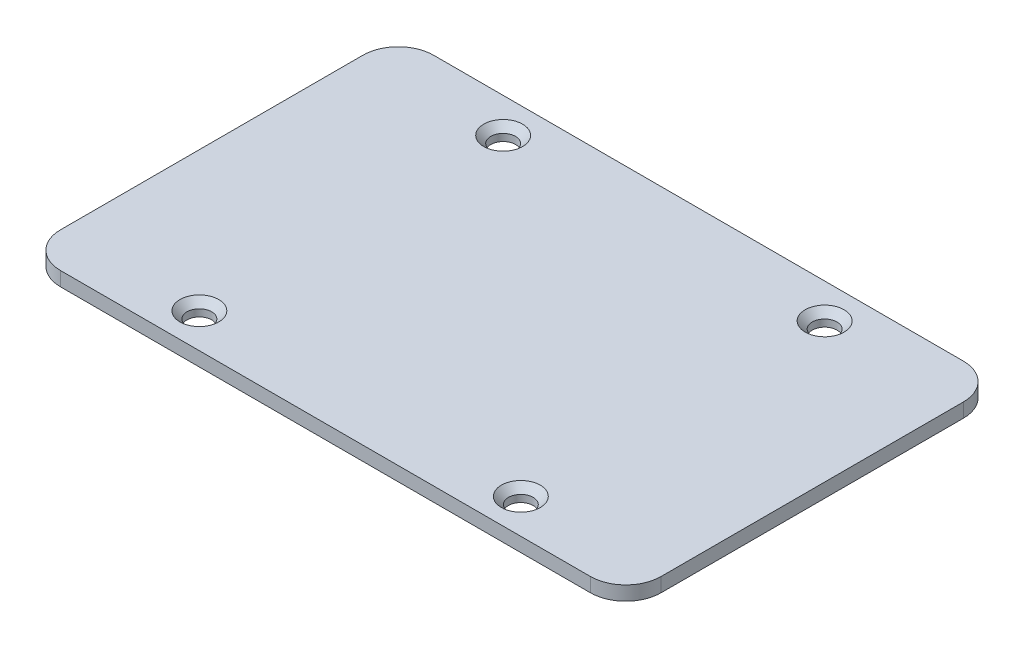
ISO-10303-21;
HEADER;
FILE_DESCRIPTION(('STEP AP214'),'2;1');
FILE_NAME('part.step','',(''),(''),'','','');
FILE_SCHEMA(('AUTOMOTIVE_DESIGN { 1 0 10303 214 1 1 1 1 }'));
ENDSEC;
DATA;
#1=APPLICATION_CONTEXT('core data for automotive mechanical design processes');
#2=APPLICATION_PROTOCOL_DEFINITION('international standard','automotive_design',2000,#1);
#3=PRODUCT_CONTEXT('',#1,'mechanical');
#4=PRODUCT('Part','Part','',(#3));
#5=PRODUCT_RELATED_PRODUCT_CATEGORY('part','',(#4));
#6=PRODUCT_DEFINITION_FORMATION('','',#4);
#7=PRODUCT_DEFINITION_CONTEXT('part definition',#1,'design');
#8=PRODUCT_DEFINITION('design','',#6,#7);
#9=PRODUCT_DEFINITION_SHAPE('','',#8);
#10=(LENGTH_UNIT() NAMED_UNIT(*) SI_UNIT(.MILLI.,.METRE.));
#11=(NAMED_UNIT(*) PLANE_ANGLE_UNIT() SI_UNIT($,.RADIAN.));
#12=(NAMED_UNIT(*) SI_UNIT($,.STERADIAN.) SOLID_ANGLE_UNIT());
#13=UNCERTAINTY_MEASURE_WITH_UNIT(LENGTH_MEASURE(1.E-05),#10,'distance_accuracy_value','');
#14=(GEOMETRIC_REPRESENTATION_CONTEXT(3) GLOBAL_UNCERTAINTY_ASSIGNED_CONTEXT((#13)) GLOBAL_UNIT_ASSIGNED_CONTEXT((#10,
#11,#12)) REPRESENTATION_CONTEXT('',''));
#15=CARTESIAN_POINT('',(0.,0.,0.));
#16=DIRECTION('',(0.,0.,1.));
#17=DIRECTION('',(1.,0.,0.));
#18=AXIS2_PLACEMENT_3D('',#15,#16,#17);
#19=CARTESIAN_POINT('',(42.5,1.,-26.4));
#20=DIRECTION('',(-1.,0.,0.));
#21=DIRECTION('',(0.,0.,1.));
#22=AXIS2_PLACEMENT_3D('',#19,#20,#21);
#23=PLANE('',#22);
#24=DIRECTION('',(0.,0.,-1.));
#25=VECTOR('',#24,1.);
#26=CARTESIAN_POINT('',(42.5,-1.,-26.4));
#27=LINE('',#26,#25);
#28=CARTESIAN_POINT('',(42.5,-1.,21.4));
#29=VERTEX_POINT('',#28);
#30=CARTESIAN_POINT('',(42.5,-1.,-21.4));
#31=VERTEX_POINT('',#30);
#32=EDGE_CURVE('E142',#29,#31,#27,.T.);
#33=ORIENTED_EDGE('',*,*,#32,.T.);
#34=DIRECTION('',(0.,-1.,0.));
#35=VECTOR('',#34,1.);
#36=CARTESIAN_POINT('',(42.5,1.,-21.4));
#37=LINE('',#36,#35);
#38=CARTESIAN_POINT('',(42.5,1.,-21.4));
#39=VERTEX_POINT('',#38);
#40=EDGE_CURVE('E120',#31,#39,#37,.F.);
#41=ORIENTED_EDGE('',*,*,#40,.T.);
#42=DIRECTION('',(0.,0.,-1.));
#43=VECTOR('',#42,1.);
#44=CARTESIAN_POINT('',(42.5,1.,-26.4));
#45=LINE('',#44,#43);
#46=CARTESIAN_POINT('',(42.5,1.,21.4));
#47=VERTEX_POINT('',#46);
#48=EDGE_CURVE('E152',#47,#39,#45,.T.);
#49=ORIENTED_EDGE('',*,*,#48,.F.);
#50=DIRECTION('',(0.,-1.,0.));
#51=VECTOR('',#50,1.);
#52=CARTESIAN_POINT('',(42.5,1.,21.4));
#53=LINE('',#52,#51);
#54=EDGE_CURVE('E125',#47,#29,#53,.T.);
#55=ORIENTED_EDGE('',*,*,#54,.T.);
#56=EDGE_LOOP('',(#33,#41,#49,#55));
#57=FACE_BOUND('',#56,.T.);
#58=ADVANCED_FACE('F49',(#57),#23,.F.);
#59=CARTESIAN_POINT('',(-42.5,1.,-26.4));
#60=DIRECTION('',(0.,0.,1.));
#61=DIRECTION('',(1.,0.,0.));
#62=AXIS2_PLACEMENT_3D('',#59,#60,#61);
#63=PLANE('',#62);
#64=DIRECTION('',(-1.,0.,0.));
#65=VECTOR('',#64,1.);
#66=CARTESIAN_POINT('',(-42.5,1.,-26.4));
#67=LINE('',#66,#65);
#68=CARTESIAN_POINT('',(37.5,1.,-26.4));
#69=VERTEX_POINT('',#68);
#70=CARTESIAN_POINT('',(-37.5,1.,-26.4));
#71=VERTEX_POINT('',#70);
#72=EDGE_CURVE('E135',#69,#71,#67,.T.);
#73=ORIENTED_EDGE('',*,*,#72,.F.);
#74=DIRECTION('',(0.,-1.,0.));
#75=VECTOR('',#74,1.);
#76=CARTESIAN_POINT('',(37.5,1.,-26.4));
#77=LINE('',#76,#75);
#78=CARTESIAN_POINT('',(37.5,-1.,-26.4));
#79=VERTEX_POINT('',#78);
#80=EDGE_CURVE('E119',#69,#79,#77,.T.);
#81=ORIENTED_EDGE('',*,*,#80,.T.);
#82=DIRECTION('',(-1.,0.,0.));
#83=VECTOR('',#82,1.);
#84=CARTESIAN_POINT('',(-42.5,-1.,-26.4));
#85=LINE('',#84,#83);
#86=CARTESIAN_POINT('',(-37.5,-1.,-26.4));
#87=VERTEX_POINT('',#86);
#88=EDGE_CURVE('E132',#79,#87,#85,.T.);
#89=ORIENTED_EDGE('',*,*,#88,.T.);
#90=DIRECTION('',(0.,-1.,0.));
#91=VECTOR('',#90,1.);
#92=CARTESIAN_POINT('',(-37.5,1.,-26.4));
#93=LINE('',#92,#91);
#94=EDGE_CURVE('E137',#87,#71,#93,.F.);
#95=ORIENTED_EDGE('',*,*,#94,.T.);
#96=EDGE_LOOP('',(#73,#81,#89,#95));
#97=FACE_BOUND('',#96,.T.);
#98=ADVANCED_FACE('F131',(#97),#63,.F.);
#99=CARTESIAN_POINT('',(-42.5,1.,-26.4));
#100=DIRECTION('',(1.,0.,0.));
#101=DIRECTION('',(0.,0.,-1.));
#102=AXIS2_PLACEMENT_3D('',#99,#100,#101);
#103=PLANE('',#102);
#104=DIRECTION('',(0.,0.,1.));
#105=VECTOR('',#104,1.);
#106=CARTESIAN_POINT('',(-42.5,-1.,-26.4));
#107=LINE('',#106,#105);
#108=CARTESIAN_POINT('',(-42.5,-1.,-21.4));
#109=VERTEX_POINT('',#108);
#110=CARTESIAN_POINT('',(-42.5,-1.,21.4));
#111=VERTEX_POINT('',#110);
#112=EDGE_CURVE('E141',#109,#111,#107,.T.);
#113=ORIENTED_EDGE('',*,*,#112,.T.);
#114=DIRECTION('',(0.,-1.,0.));
#115=VECTOR('',#114,1.);
#116=CARTESIAN_POINT('',(-42.5,1.,21.4));
#117=LINE('',#116,#115);
#118=CARTESIAN_POINT('',(-42.5,1.,21.4));
#119=VERTEX_POINT('',#118);
#120=EDGE_CURVE('E11',#111,#119,#117,.F.);
#121=ORIENTED_EDGE('',*,*,#120,.T.);
#122=DIRECTION('',(0.,0.,1.));
#123=VECTOR('',#122,1.);
#124=CARTESIAN_POINT('',(-42.5,1.,-26.4));
#125=LINE('',#124,#123);
#126=CARTESIAN_POINT('',(-42.5,1.,-21.4));
#127=VERTEX_POINT('',#126);
#128=EDGE_CURVE('E202',#127,#119,#125,.T.);
#129=ORIENTED_EDGE('',*,*,#128,.F.);
#130=DIRECTION('',(0.,-1.,0.));
#131=VECTOR('',#130,1.);
#132=CARTESIAN_POINT('',(-42.5,1.,-21.4));
#133=LINE('',#132,#131);
#134=EDGE_CURVE('E57',#127,#109,#133,.T.);
#135=ORIENTED_EDGE('',*,*,#134,.T.);
#136=EDGE_LOOP('',(#113,#121,#129,#135));
#137=FACE_BOUND('',#136,.T.);
#138=ADVANCED_FACE('F200',(#137),#103,.F.);
#139=CARTESIAN_POINT('',(-42.5,1.,26.4));
#140=DIRECTION('',(0.,0.,-1.));
#141=DIRECTION('',(-1.,0.,0.));
#142=AXIS2_PLACEMENT_3D('',#139,#140,#141);
#143=PLANE('',#142);
#144=DIRECTION('',(1.,0.,0.));
#145=VECTOR('',#144,1.);
#146=CARTESIAN_POINT('',(-42.5,-1.,26.4));
#147=LINE('',#146,#145);
#148=CARTESIAN_POINT('',(-37.5,-1.,26.4));
#149=VERTEX_POINT('',#148);
#150=CARTESIAN_POINT('',(37.5,-1.,26.4));
#151=VERTEX_POINT('',#150);
#152=EDGE_CURVE('E145',#149,#151,#147,.T.);
#153=ORIENTED_EDGE('',*,*,#152,.T.);
#154=DIRECTION('',(0.,-1.,0.));
#155=VECTOR('',#154,1.);
#156=CARTESIAN_POINT('',(37.5,1.,26.4));
#157=LINE('',#156,#155);
#158=CARTESIAN_POINT('',(37.5,1.,26.4));
#159=VERTEX_POINT('',#158);
#160=EDGE_CURVE('E64',#151,#159,#157,.F.);
#161=ORIENTED_EDGE('',*,*,#160,.T.);
#162=DIRECTION('',(1.,0.,0.));
#163=VECTOR('',#162,1.);
#164=CARTESIAN_POINT('',(-42.5,1.,26.4));
#165=LINE('',#164,#163);
#166=CARTESIAN_POINT('',(-37.5,1.,26.4));
#167=VERTEX_POINT('',#166);
#168=EDGE_CURVE('E157',#167,#159,#165,.T.);
#169=ORIENTED_EDGE('',*,*,#168,.F.);
#170=DIRECTION('',(0.,-1.,0.));
#171=VECTOR('',#170,1.);
#172=CARTESIAN_POINT('',(-37.5,1.,26.4));
#173=LINE('',#172,#171);
#174=EDGE_CURVE('E193',#167,#149,#173,.T.);
#175=ORIENTED_EDGE('',*,*,#174,.T.);
#176=EDGE_LOOP('',(#153,#161,#169,#175));
#177=FACE_BOUND('',#176,.T.);
#178=ADVANCED_FACE('F209',(#177),#143,.F.);
#179=CARTESIAN_POINT('',(0.,1.,0.));
#180=DIRECTION('',(0.,1.,0.));
#181=DIRECTION('',(0.,0.,1.));
#182=AXIS2_PLACEMENT_3D('',#179,#180,#181);
#183=PLANE('',#182);
#184=CARTESIAN_POINT('',(22.75,1.,-21.5));
#185=DIRECTION('',(0.,1.,0.));
#186=DIRECTION('',(0.,0.,1.));
#187=AXIS2_PLACEMENT_3D('',#184,#185,#186);
#188=CIRCLE('',#187,2.75000000000002);
#189=CARTESIAN_POINT('',(22.75,1.,-18.75));
#190=VERTEX_POINT('',#189);
#191=EDGE_CURVE('E166',#190,#190,#188,.F.);
#192=ORIENTED_EDGE('',*,*,#191,.T.);
#193=EDGE_LOOP('',(#192));
#194=FACE_BOUND('',#193,.T.);
#195=CARTESIAN_POINT('',(22.75,1.,21.5));
#196=DIRECTION('',(0.,1.,0.));
#197=DIRECTION('',(0.,0.,1.));
#198=AXIS2_PLACEMENT_3D('',#195,#196,#197);
#199=CIRCLE('',#198,2.75000000000002);
#200=CARTESIAN_POINT('',(22.75,1.,24.25));
#201=VERTEX_POINT('',#200);
#202=EDGE_CURVE('E163',#201,#201,#199,.F.);
#203=ORIENTED_EDGE('',*,*,#202,.T.);
#204=EDGE_LOOP('',(#203));
#205=FACE_BOUND('',#204,.T.);
#206=CARTESIAN_POINT('',(-22.75,1.,21.5));
#207=DIRECTION('',(0.,1.,0.));
#208=DIRECTION('',(0.,0.,1.));
#209=AXIS2_PLACEMENT_3D('',#206,#207,#208);
#210=CIRCLE('',#209,2.75000000000002);
#211=CARTESIAN_POINT('',(-22.75,1.,24.25));
#212=VERTEX_POINT('',#211);
#213=EDGE_CURVE('E160',#212,#212,#210,.F.);
#214=ORIENTED_EDGE('',*,*,#213,.T.);
#215=EDGE_LOOP('',(#214));
#216=FACE_BOUND('',#215,.T.);
#217=CARTESIAN_POINT('',(-22.75,1.,-21.5));
#218=DIRECTION('',(0.,1.,0.));
#219=DIRECTION('',(0.,0.,1.));
#220=AXIS2_PLACEMENT_3D('',#217,#218,#219);
#221=CIRCLE('',#220,2.75000000000002);
#222=CARTESIAN_POINT('',(-22.75,1.,-18.75));
#223=VERTEX_POINT('',#222);
#224=EDGE_CURVE('E156',#223,#223,#221,.F.);
#225=ORIENTED_EDGE('',*,*,#224,.T.);
#226=EDGE_LOOP('',(#225));
#227=FACE_BOUND('',#226,.T.);
#228=ORIENTED_EDGE('',*,*,#48,.T.);
#229=CARTESIAN_POINT('',(37.5,1.,-21.4));
#230=DIRECTION('',(0.,1.,0.));
#231=DIRECTION('',(0.,0.,1.));
#232=AXIS2_PLACEMENT_3D('',#229,#230,#231);
#233=CIRCLE('',#232,5.);
#234=EDGE_CURVE('E191',#39,#69,#233,.T.);
#235=ORIENTED_EDGE('',*,*,#234,.T.);
#236=ORIENTED_EDGE('',*,*,#72,.T.);
#237=CARTESIAN_POINT('',(-37.5,1.,-21.4));
#238=DIRECTION('',(0.,1.,0.));
#239=DIRECTION('',(0.,0.,1.));
#240=AXIS2_PLACEMENT_3D('',#237,#238,#239);
#241=CIRCLE('',#240,5.);
#242=EDGE_CURVE('E186',#71,#127,#241,.T.);
#243=ORIENTED_EDGE('',*,*,#242,.T.);
#244=ORIENTED_EDGE('',*,*,#128,.T.);
#245=CARTESIAN_POINT('',(-37.5,1.,21.4));
#246=DIRECTION('',(0.,1.,0.));
#247=DIRECTION('',(0.,0.,1.));
#248=AXIS2_PLACEMENT_3D('',#245,#246,#247);
#249=CIRCLE('',#248,5.);
#250=EDGE_CURVE('E71',#119,#167,#249,.T.);
#251=ORIENTED_EDGE('',*,*,#250,.T.);
#252=ORIENTED_EDGE('',*,*,#168,.T.);
#253=CARTESIAN_POINT('',(37.5,1.,21.4));
#254=DIRECTION('',(0.,1.,0.));
#255=DIRECTION('',(0.,0.,1.));
#256=AXIS2_PLACEMENT_3D('',#253,#254,#255);
#257=CIRCLE('',#256,5.);
#258=EDGE_CURVE('E189',#159,#47,#257,.T.);
#259=ORIENTED_EDGE('',*,*,#258,.T.);
#260=EDGE_LOOP('',(#228,#235,#236,#243,#244,#251,#252,#259));
#261=FACE_BOUND('',#260,.T.);
#262=ADVANCED_FACE('F293',(#194,#205,#216,#227,#261),#183,.T.);
#263=CARTESIAN_POINT('',(0.,-1.,0.));
#264=DIRECTION('',(0.,1.,0.));
#265=DIRECTION('',(0.,0.,1.));
#266=AXIS2_PLACEMENT_3D('',#263,#264,#265);
#267=PLANE('',#266);
#268=CARTESIAN_POINT('',(-22.75,-1.,21.5));
#269=DIRECTION('',(0.,1.,0.));
#270=DIRECTION('',(0.,0.,1.));
#271=AXIS2_PLACEMENT_3D('',#268,#269,#270);
#272=CIRCLE('',#271,1.75);
#273=CARTESIAN_POINT('',(-22.75,-1.,23.25));
#274=VERTEX_POINT('',#273);
#275=EDGE_CURVE('E219',#274,#274,#272,.T.);
#276=ORIENTED_EDGE('',*,*,#275,.T.);
#277=EDGE_LOOP('',(#276));
#278=FACE_BOUND('',#277,.T.);
#279=CARTESIAN_POINT('',(22.75,-1.,21.5));
#280=DIRECTION('',(0.,1.,0.));
#281=DIRECTION('',(0.,0.,1.));
#282=AXIS2_PLACEMENT_3D('',#279,#280,#281);
#283=CIRCLE('',#282,1.75);
#284=CARTESIAN_POINT('',(22.75,-1.,23.25));
#285=VERTEX_POINT('',#284);
#286=EDGE_CURVE('E222',#285,#285,#283,.T.);
#287=ORIENTED_EDGE('',*,*,#286,.T.);
#288=EDGE_LOOP('',(#287));
#289=FACE_BOUND('',#288,.T.);
#290=CARTESIAN_POINT('',(22.75,-1.,-21.5));
#291=DIRECTION('',(0.,1.,0.));
#292=DIRECTION('',(0.,0.,1.));
#293=AXIS2_PLACEMENT_3D('',#290,#291,#292);
#294=CIRCLE('',#293,1.75);
#295=CARTESIAN_POINT('',(22.75,-1.,-19.75));
#296=VERTEX_POINT('',#295);
#297=EDGE_CURVE('E218',#296,#296,#294,.T.);
#298=ORIENTED_EDGE('',*,*,#297,.T.);
#299=EDGE_LOOP('',(#298));
#300=FACE_BOUND('',#299,.T.);
#301=CARTESIAN_POINT('',(-22.75,-1.,-21.5));
#302=DIRECTION('',(0.,1.,0.));
#303=DIRECTION('',(0.,0.,1.));
#304=AXIS2_PLACEMENT_3D('',#301,#302,#303);
#305=CIRCLE('',#304,1.75);
#306=CARTESIAN_POINT('',(-22.75,-1.,-19.75));
#307=VERTEX_POINT('',#306);
#308=EDGE_CURVE('E147',#307,#307,#305,.T.);
#309=ORIENTED_EDGE('',*,*,#308,.T.);
#310=EDGE_LOOP('',(#309));
#311=FACE_BOUND('',#310,.T.);
#312=ORIENTED_EDGE('',*,*,#88,.F.);
#313=CARTESIAN_POINT('',(37.5,-1.,-21.4));
#314=DIRECTION('',(0.,1.,0.));
#315=DIRECTION('',(0.,0.,1.));
#316=AXIS2_PLACEMENT_3D('',#313,#314,#315);
#317=CIRCLE('',#316,5.);
#318=EDGE_CURVE('E115',#79,#31,#317,.F.);
#319=ORIENTED_EDGE('',*,*,#318,.T.);
#320=ORIENTED_EDGE('',*,*,#32,.F.);
#321=CARTESIAN_POINT('',(37.5,-1.,21.4));
#322=DIRECTION('',(0.,1.,0.));
#323=DIRECTION('',(0.,0.,1.));
#324=AXIS2_PLACEMENT_3D('',#321,#322,#323);
#325=CIRCLE('',#324,5.);
#326=EDGE_CURVE('E126',#29,#151,#325,.F.);
#327=ORIENTED_EDGE('',*,*,#326,.T.);
#328=ORIENTED_EDGE('',*,*,#152,.F.);
#329=CARTESIAN_POINT('',(-37.5,-1.,21.4));
#330=DIRECTION('',(0.,1.,0.));
#331=DIRECTION('',(0.,0.,1.));
#332=AXIS2_PLACEMENT_3D('',#329,#330,#331);
#333=CIRCLE('',#332,5.);
#334=EDGE_CURVE('E180',#149,#111,#333,.F.);
#335=ORIENTED_EDGE('',*,*,#334,.T.);
#336=ORIENTED_EDGE('',*,*,#112,.F.);
#337=CARTESIAN_POINT('',(-37.5,-1.,-21.4));
#338=DIRECTION('',(0.,1.,0.));
#339=DIRECTION('',(0.,0.,1.));
#340=AXIS2_PLACEMENT_3D('',#337,#338,#339);
#341=CIRCLE('',#340,5.);
#342=EDGE_CURVE('E136',#109,#87,#341,.F.);
#343=ORIENTED_EDGE('',*,*,#342,.T.);
#344=EDGE_LOOP('',(#312,#319,#320,#327,#328,#335,#336,#343));
#345=FACE_BOUND('',#344,.T.);
#346=ADVANCED_FACE('F139',(#278,#289,#300,#311,#345),#267,.F.);
#347=CARTESIAN_POINT('',(-22.75,-1.,-21.5));
#348=DIRECTION('',(0.,1.,0.));
#349=DIRECTION('',(0.,0.,1.));
#350=AXIS2_PLACEMENT_3D('',#347,#348,#349);
#351=CYLINDRICAL_SURFACE('',#350,1.75);
#352=CARTESIAN_POINT('',(-22.75,0.,-21.5));
#353=DIRECTION('',(0.,1.,0.));
#354=DIRECTION('',(0.,0.,1.));
#355=AXIS2_PLACEMENT_3D('',#352,#353,#354);
#356=CIRCLE('',#355,1.75);
#357=CARTESIAN_POINT('',(-22.75,0.,-19.75));
#358=VERTEX_POINT('',#357);
#359=EDGE_CURVE('E175',#358,#358,#356,.T.);
#360=ORIENTED_EDGE('',*,*,#359,.T.);
#361=EDGE_LOOP('',(#360));
#362=FACE_BOUND('',#361,.T.);
#363=ORIENTED_EDGE('',*,*,#308,.F.);
#364=EDGE_LOOP('',(#363));
#365=FACE_BOUND('',#364,.T.);
#366=ADVANCED_FACE('F233',(#362,#365),#351,.F.);
#367=CARTESIAN_POINT('',(22.75,-1.,-21.5));
#368=DIRECTION('',(0.,1.,0.));
#369=DIRECTION('',(0.,0.,1.));
#370=AXIS2_PLACEMENT_3D('',#367,#368,#369);
#371=CYLINDRICAL_SURFACE('',#370,1.75);
#372=CARTESIAN_POINT('',(22.75,0.,-21.5));
#373=DIRECTION('',(0.,1.,0.));
#374=DIRECTION('',(0.,0.,1.));
#375=AXIS2_PLACEMENT_3D('',#372,#373,#374);
#376=CIRCLE('',#375,1.75);
#377=CARTESIAN_POINT('',(22.75,0.,-19.75));
#378=VERTEX_POINT('',#377);
#379=EDGE_CURVE('E153',#378,#378,#376,.T.);
#380=ORIENTED_EDGE('',*,*,#379,.T.);
#381=EDGE_LOOP('',(#380));
#382=FACE_BOUND('',#381,.T.);
#383=ORIENTED_EDGE('',*,*,#297,.F.);
#384=EDGE_LOOP('',(#383));
#385=FACE_BOUND('',#384,.T.);
#386=ADVANCED_FACE('F230',(#382,#385),#371,.F.);
#387=CARTESIAN_POINT('',(22.75,-1.,21.5));
#388=DIRECTION('',(0.,1.,0.));
#389=DIRECTION('',(0.,0.,1.));
#390=AXIS2_PLACEMENT_3D('',#387,#388,#389);
#391=CYLINDRICAL_SURFACE('',#390,1.75);
#392=CARTESIAN_POINT('',(22.75,0.,21.5));
#393=DIRECTION('',(0.,1.,0.));
#394=DIRECTION('',(0.,0.,1.));
#395=AXIS2_PLACEMENT_3D('',#392,#393,#394);
#396=CIRCLE('',#395,1.75);
#397=CARTESIAN_POINT('',(22.75,0.,23.25));
#398=VERTEX_POINT('',#397);
#399=EDGE_CURVE('E169',#398,#398,#396,.T.);
#400=ORIENTED_EDGE('',*,*,#399,.T.);
#401=EDGE_LOOP('',(#400));
#402=FACE_BOUND('',#401,.T.);
#403=ORIENTED_EDGE('',*,*,#286,.F.);
#404=EDGE_LOOP('',(#403));
#405=FACE_BOUND('',#404,.T.);
#406=ADVANCED_FACE('F232',(#402,#405),#391,.F.);
#407=CARTESIAN_POINT('',(-22.75,-1.,21.5));
#408=DIRECTION('',(0.,1.,0.));
#409=DIRECTION('',(0.,0.,1.));
#410=AXIS2_PLACEMENT_3D('',#407,#408,#409);
#411=CYLINDRICAL_SURFACE('',#410,1.75);
#412=CARTESIAN_POINT('',(-22.75,0.,21.5));
#413=DIRECTION('',(0.,1.,0.));
#414=DIRECTION('',(0.,0.,1.));
#415=AXIS2_PLACEMENT_3D('',#412,#413,#414);
#416=CIRCLE('',#415,1.75);
#417=CARTESIAN_POINT('',(-22.75,0.,23.25));
#418=VERTEX_POINT('',#417);
#419=EDGE_CURVE('E172',#418,#418,#416,.T.);
#420=ORIENTED_EDGE('',*,*,#419,.T.);
#421=EDGE_LOOP('',(#420));
#422=FACE_BOUND('',#421,.T.);
#423=ORIENTED_EDGE('',*,*,#275,.F.);
#424=EDGE_LOOP('',(#423));
#425=FACE_BOUND('',#424,.T.);
#426=ADVANCED_FACE('F240',(#422,#425),#411,.F.);
#427=CARTESIAN_POINT('',(22.75,0.,-21.5));
#428=DIRECTION('',(0.,1.,0.));
#429=DIRECTION('',(0.,0.,1.));
#430=AXIS2_PLACEMENT_3D('',#427,#428,#429);
#431=CONICAL_SURFACE('',#430,1.75,0.785398163397452);
#432=ORIENTED_EDGE('',*,*,#191,.F.);
#433=EDGE_LOOP('',(#432));
#434=FACE_BOUND('',#433,.T.);
#435=ORIENTED_EDGE('',*,*,#379,.F.);
#436=EDGE_LOOP('',(#435));
#437=FACE_BOUND('',#436,.T.);
#438=ADVANCED_FACE('F255',(#434,#437),#431,.F.);
#439=CARTESIAN_POINT('',(22.75,0.,21.5));
#440=DIRECTION('',(0.,1.,0.));
#441=DIRECTION('',(0.,0.,1.));
#442=AXIS2_PLACEMENT_3D('',#439,#440,#441);
#443=CONICAL_SURFACE('',#442,1.75,0.785398163397452);
#444=ORIENTED_EDGE('',*,*,#202,.F.);
#445=EDGE_LOOP('',(#444));
#446=FACE_BOUND('',#445,.T.);
#447=ORIENTED_EDGE('',*,*,#399,.F.);
#448=EDGE_LOOP('',(#447));
#449=FACE_BOUND('',#448,.T.);
#450=ADVANCED_FACE('F261',(#446,#449),#443,.F.);
#451=CARTESIAN_POINT('',(-22.75,0.,21.5));
#452=DIRECTION('',(0.,1.,0.));
#453=DIRECTION('',(0.,0.,1.));
#454=AXIS2_PLACEMENT_3D('',#451,#452,#453);
#455=CONICAL_SURFACE('',#454,1.75,0.785398163397452);
#456=ORIENTED_EDGE('',*,*,#213,.F.);
#457=EDGE_LOOP('',(#456));
#458=FACE_BOUND('',#457,.T.);
#459=ORIENTED_EDGE('',*,*,#419,.F.);
#460=EDGE_LOOP('',(#459));
#461=FACE_BOUND('',#460,.T.);
#462=ADVANCED_FACE('F268',(#458,#461),#455,.F.);
#463=CARTESIAN_POINT('',(-22.75,0.,-21.5));
#464=DIRECTION('',(0.,1.,0.));
#465=DIRECTION('',(0.,0.,1.));
#466=AXIS2_PLACEMENT_3D('',#463,#464,#465);
#467=CONICAL_SURFACE('',#466,1.75,0.785398163397452);
#468=ORIENTED_EDGE('',*,*,#224,.F.);
#469=EDGE_LOOP('',(#468));
#470=FACE_BOUND('',#469,.T.);
#471=ORIENTED_EDGE('',*,*,#359,.F.);
#472=EDGE_LOOP('',(#471));
#473=FACE_BOUND('',#472,.T.);
#474=ADVANCED_FACE('F275',(#470,#473),#467,.F.);
#475=CARTESIAN_POINT('',(37.5,1.,-21.4));
#476=DIRECTION('',(0.,-1.,0.));
#477=DIRECTION('',(0.,0.,-1.));
#478=AXIS2_PLACEMENT_3D('',#475,#476,#477);
#479=CYLINDRICAL_SURFACE('',#478,5.);
#480=ORIENTED_EDGE('',*,*,#234,.F.);
#481=ORIENTED_EDGE('',*,*,#40,.F.);
#482=ORIENTED_EDGE('',*,*,#318,.F.);
#483=ORIENTED_EDGE('',*,*,#80,.F.);
#484=EDGE_LOOP('',(#480,#481,#482,#483));
#485=FACE_BOUND('',#484,.T.);
#486=ADVANCED_FACE('F118',(#485),#479,.T.);
#487=CARTESIAN_POINT('',(37.5,1.,21.4));
#488=DIRECTION('',(0.,-1.,0.));
#489=DIRECTION('',(0.,0.,-1.));
#490=AXIS2_PLACEMENT_3D('',#487,#488,#489);
#491=CYLINDRICAL_SURFACE('',#490,5.);
#492=ORIENTED_EDGE('',*,*,#258,.F.);
#493=ORIENTED_EDGE('',*,*,#160,.F.);
#494=ORIENTED_EDGE('',*,*,#326,.F.);
#495=ORIENTED_EDGE('',*,*,#54,.F.);
#496=EDGE_LOOP('',(#492,#493,#494,#495));
#497=FACE_BOUND('',#496,.T.);
#498=ADVANCED_FACE('F284',(#497),#491,.T.);
#499=CARTESIAN_POINT('',(-37.5,1.,21.4));
#500=DIRECTION('',(0.,-1.,0.));
#501=DIRECTION('',(0.,0.,-1.));
#502=AXIS2_PLACEMENT_3D('',#499,#500,#501);
#503=CYLINDRICAL_SURFACE('',#502,5.);
#504=ORIENTED_EDGE('',*,*,#250,.F.);
#505=ORIENTED_EDGE('',*,*,#120,.F.);
#506=ORIENTED_EDGE('',*,*,#334,.F.);
#507=ORIENTED_EDGE('',*,*,#174,.F.);
#508=EDGE_LOOP('',(#504,#505,#506,#507));
#509=FACE_BOUND('',#508,.T.);
#510=ADVANCED_FACE('F208',(#509),#503,.T.);
#511=CARTESIAN_POINT('',(-37.5,1.,-21.4));
#512=DIRECTION('',(0.,-1.,0.));
#513=DIRECTION('',(0.,0.,-1.));
#514=AXIS2_PLACEMENT_3D('',#511,#512,#513);
#515=CYLINDRICAL_SURFACE('',#514,5.);
#516=ORIENTED_EDGE('',*,*,#242,.F.);
#517=ORIENTED_EDGE('',*,*,#94,.F.);
#518=ORIENTED_EDGE('',*,*,#342,.F.);
#519=ORIENTED_EDGE('',*,*,#134,.F.);
#520=EDGE_LOOP('',(#516,#517,#518,#519));
#521=FACE_BOUND('',#520,.T.);
#522=ADVANCED_FACE('F51',(#521),#515,.T.);
#523=CLOSED_SHELL('',(#58,#98,#138,#178,#262,#346,#366,#386,#406,#426,#438,#450,#462,#474,#486,
#498,#510,#522));
#524=MANIFOLD_SOLID_BREP('B2',#523);
#525=ADVANCED_BREP_SHAPE_REPRESENTATION('',(#18,#524),#14);
#526=SHAPE_DEFINITION_REPRESENTATION(#9,#525);
ENDSEC;
END-ISO-10303-21;
